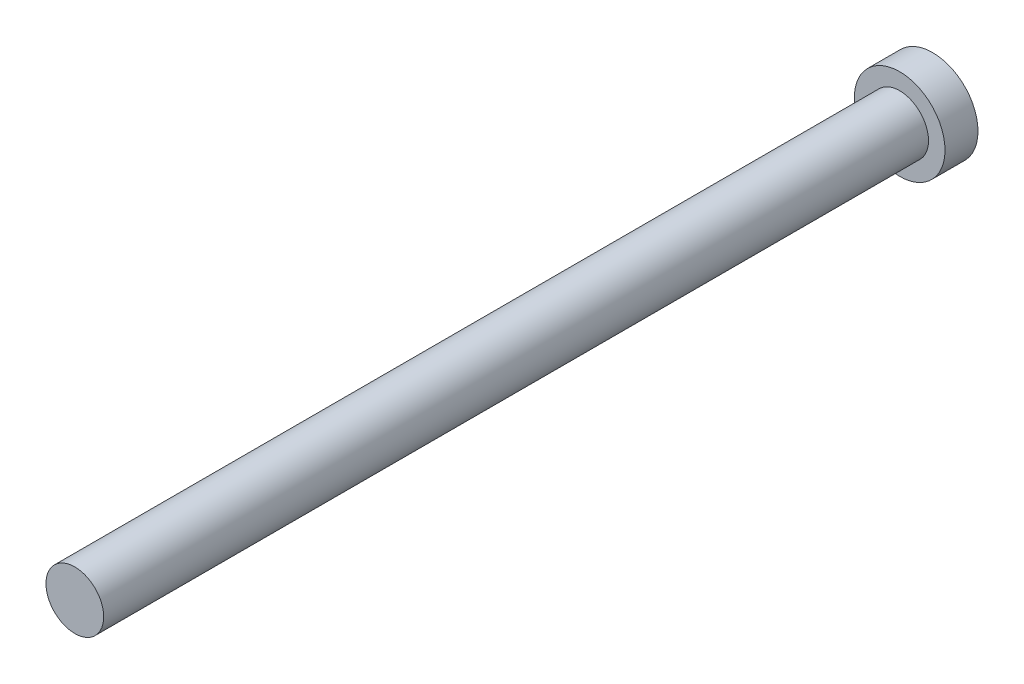
ISO-10303-21;
HEADER;
FILE_DESCRIPTION(('STEP AP214'),'2;1');
FILE_NAME('part.step','',(''),(''),'','','');
FILE_SCHEMA(('AUTOMOTIVE_DESIGN { 1 0 10303 214 1 1 1 1 }'));
ENDSEC;
DATA;
#1=APPLICATION_CONTEXT('core data for automotive mechanical design processes');
#2=APPLICATION_PROTOCOL_DEFINITION('international standard','automotive_design',2000,#1);
#3=PRODUCT_CONTEXT('',#1,'mechanical');
#4=PRODUCT('Part','Part','',(#3));
#5=PRODUCT_RELATED_PRODUCT_CATEGORY('part','',(#4));
#6=PRODUCT_DEFINITION_FORMATION('','',#4);
#7=PRODUCT_DEFINITION_CONTEXT('part definition',#1,'design');
#8=PRODUCT_DEFINITION('design','',#6,#7);
#9=PRODUCT_DEFINITION_SHAPE('','',#8);
#10=(LENGTH_UNIT() NAMED_UNIT(*) SI_UNIT(.MILLI.,.METRE.));
#11=(NAMED_UNIT(*) PLANE_ANGLE_UNIT() SI_UNIT($,.RADIAN.));
#12=(NAMED_UNIT(*) SI_UNIT($,.STERADIAN.) SOLID_ANGLE_UNIT());
#13=UNCERTAINTY_MEASURE_WITH_UNIT(LENGTH_MEASURE(1.E-05),#10,'distance_accuracy_value','');
#14=(GEOMETRIC_REPRESENTATION_CONTEXT(3) GLOBAL_UNCERTAINTY_ASSIGNED_CONTEXT((#13)) GLOBAL_UNIT_ASSIGNED_CONTEXT((#10,
#11,#12)) REPRESENTATION_CONTEXT('',''));
#15=CARTESIAN_POINT('',(0.,0.,0.));
#16=DIRECTION('',(0.,0.,1.));
#17=DIRECTION('',(1.,0.,0.));
#18=AXIS2_PLACEMENT_3D('',#15,#16,#17);
#19=CARTESIAN_POINT('',(0.,0.,2.));
#20=DIRECTION('',(0.,0.,1.));
#21=DIRECTION('',(1.,0.,0.));
#22=AXIS2_PLACEMENT_3D('',#19,#20,#21);
#23=PLANE('',#22);
#24=CARTESIAN_POINT('',(0.,0.,2.));
#25=DIRECTION('',(0.,0.,1.));
#26=DIRECTION('',(1.,0.,0.));
#27=AXIS2_PLACEMENT_3D('',#24,#25,#26);
#28=CIRCLE('',#27,2.75);
#29=CARTESIAN_POINT('',(2.75,0.,2.));
#30=VERTEX_POINT('',#29);
#31=EDGE_CURVE('E10',#30,#30,#28,.T.);
#32=ORIENTED_EDGE('',*,*,#31,.T.);
#33=EDGE_LOOP('',(#32));
#34=FACE_BOUND('',#33,.T.);
#35=CARTESIAN_POINT('',(0.,0.,2.));
#36=DIRECTION('',(0.,0.,1.));
#37=DIRECTION('',(1.,0.,0.));
#38=AXIS2_PLACEMENT_3D('',#35,#36,#37);
#39=CIRCLE('',#38,1.75);
#40=CARTESIAN_POINT('',(1.75,0.,2.));
#41=VERTEX_POINT('',#40);
#42=EDGE_CURVE('E42',#41,#41,#39,.T.);
#43=ORIENTED_EDGE('',*,*,#42,.F.);
#44=EDGE_LOOP('',(#43));
#45=FACE_BOUND('',#44,.T.);
#46=ADVANCED_FACE('F29',(#34,#45),#23,.T.);
#47=CARTESIAN_POINT('',(0.,0.,2.));
#48=DIRECTION('',(0.,0.,-1.));
#49=DIRECTION('',(-1.,0.,0.));
#50=AXIS2_PLACEMENT_3D('',#47,#48,#49);
#51=CYLINDRICAL_SURFACE('',#50,2.75);
#52=ORIENTED_EDGE('',*,*,#31,.F.);
#53=EDGE_LOOP('',(#52));
#54=FACE_BOUND('',#53,.T.);
#55=CARTESIAN_POINT('',(0.,0.,0.));
#56=DIRECTION('',(0.,0.,1.));
#57=DIRECTION('',(1.,0.,0.));
#58=AXIS2_PLACEMENT_3D('',#55,#56,#57);
#59=CIRCLE('',#58,2.75);
#60=CARTESIAN_POINT('',(2.75,0.,0.));
#61=VERTEX_POINT('',#60);
#62=EDGE_CURVE('E33',#61,#61,#59,.T.);
#63=ORIENTED_EDGE('',*,*,#62,.T.);
#64=EDGE_LOOP('',(#63));
#65=FACE_BOUND('',#64,.T.);
#66=ADVANCED_FACE('F31',(#54,#65),#51,.T.);
#67=CARTESIAN_POINT('',(0.,0.,0.));
#68=DIRECTION('',(0.,0.,1.));
#69=DIRECTION('',(1.,0.,0.));
#70=AXIS2_PLACEMENT_3D('',#67,#68,#69);
#71=PLANE('',#70);
#72=ORIENTED_EDGE('',*,*,#62,.F.);
#73=EDGE_LOOP('',(#72));
#74=FACE_BOUND('',#73,.T.);
#75=ADVANCED_FACE('F53',(#74),#71,.F.);
#76=CARTESIAN_POINT('',(0.,0.,52.));
#77=DIRECTION('',(0.,0.,-1.));
#78=DIRECTION('',(-1.,0.,0.));
#79=AXIS2_PLACEMENT_3D('',#76,#77,#78);
#80=CYLINDRICAL_SURFACE('',#79,1.75);
#81=CARTESIAN_POINT('',(0.,0.,52.));
#82=DIRECTION('',(0.,0.,1.));
#83=DIRECTION('',(1.,0.,0.));
#84=AXIS2_PLACEMENT_3D('',#81,#82,#83);
#85=CIRCLE('',#84,1.75);
#86=CARTESIAN_POINT('',(1.75,0.,52.));
#87=VERTEX_POINT('',#86);
#88=EDGE_CURVE('E40',#87,#87,#85,.T.);
#89=ORIENTED_EDGE('',*,*,#88,.F.);
#90=EDGE_LOOP('',(#89));
#91=FACE_BOUND('',#90,.T.);
#92=ORIENTED_EDGE('',*,*,#42,.T.);
#93=EDGE_LOOP('',(#92));
#94=FACE_BOUND('',#93,.T.);
#95=ADVANCED_FACE('F50',(#91,#94),#80,.T.);
#96=CARTESIAN_POINT('',(0.,0.,52.));
#97=DIRECTION('',(0.,0.,1.));
#98=DIRECTION('',(1.,0.,0.));
#99=AXIS2_PLACEMENT_3D('',#96,#97,#98);
#100=PLANE('',#99);
#101=ORIENTED_EDGE('',*,*,#88,.T.);
#102=EDGE_LOOP('',(#101));
#103=FACE_BOUND('',#102,.T.);
#104=ADVANCED_FACE('F48',(#103),#100,.T.);
#105=CLOSED_SHELL('',(#46,#66,#75,#95,#104));
#106=MANIFOLD_SOLID_BREP('B2',#105);
#107=ADVANCED_BREP_SHAPE_REPRESENTATION('',(#18,#106),#14);
#108=SHAPE_DEFINITION_REPRESENTATION(#9,#107);
ENDSEC;
END-ISO-10303-21;
